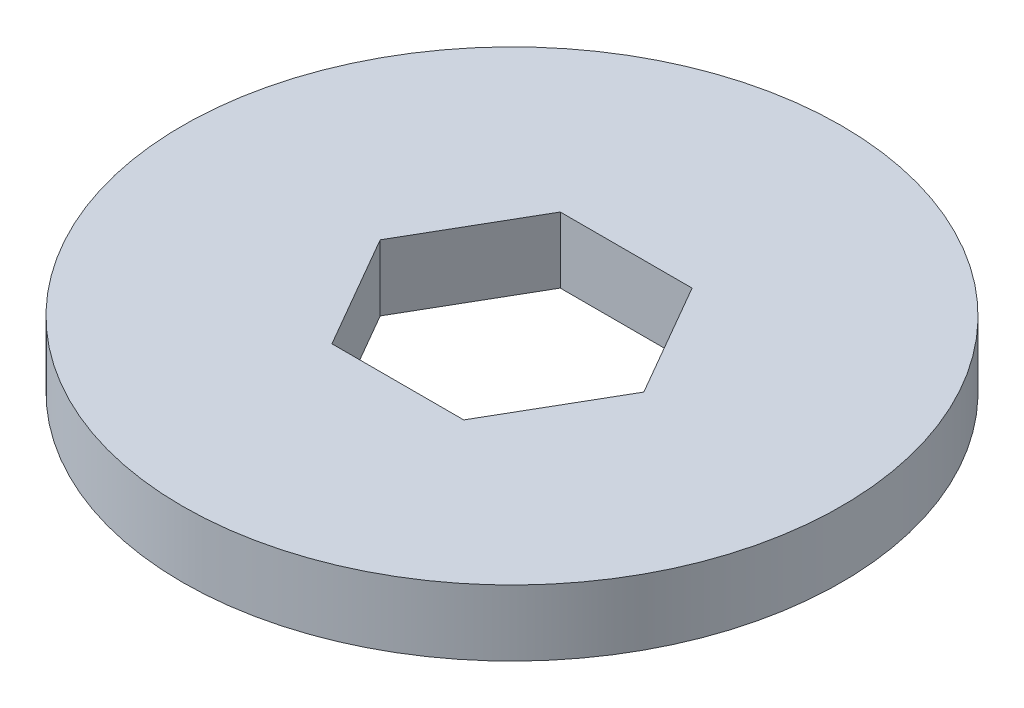
ISO-10303-21;
HEADER;
FILE_DESCRIPTION(('STEP AP214'),'2;1');
FILE_NAME('part.step','',(''),(''),'','','');
FILE_SCHEMA(('AUTOMOTIVE_DESIGN { 1 0 10303 214 1 1 1 1 }'));
ENDSEC;
DATA;
#1=APPLICATION_CONTEXT('core data for automotive mechanical design processes');
#2=APPLICATION_PROTOCOL_DEFINITION('international standard','automotive_design',2000,#1);
#3=PRODUCT_CONTEXT('',#1,'mechanical');
#4=PRODUCT('Part','Part','',(#3));
#5=PRODUCT_RELATED_PRODUCT_CATEGORY('part','',(#4));
#6=PRODUCT_DEFINITION_FORMATION('','',#4);
#7=PRODUCT_DEFINITION_CONTEXT('part definition',#1,'design');
#8=PRODUCT_DEFINITION('design','',#6,#7);
#9=PRODUCT_DEFINITION_SHAPE('','',#8);
#10=(LENGTH_UNIT() NAMED_UNIT(*) SI_UNIT(.MILLI.,.METRE.));
#11=(NAMED_UNIT(*) PLANE_ANGLE_UNIT() SI_UNIT($,.RADIAN.));
#12=(NAMED_UNIT(*) SI_UNIT($,.STERADIAN.) SOLID_ANGLE_UNIT());
#13=UNCERTAINTY_MEASURE_WITH_UNIT(LENGTH_MEASURE(1.E-05),#10,'distance_accuracy_value','');
#14=(GEOMETRIC_REPRESENTATION_CONTEXT(3) GLOBAL_UNCERTAINTY_ASSIGNED_CONTEXT((#13)) GLOBAL_UNIT_ASSIGNED_CONTEXT((#10,
#11,#12)) REPRESENTATION_CONTEXT('',''));
#15=CARTESIAN_POINT('',(0.,0.,0.));
#16=DIRECTION('',(0.,0.,1.));
#17=DIRECTION('',(1.,0.,0.));
#18=AXIS2_PLACEMENT_3D('',#15,#16,#17);
#19=CARTESIAN_POINT('',(0.,2.,0.));
#20=DIRECTION('',(0.,1.,0.));
#21=DIRECTION('',(0.,0.,1.));
#22=AXIS2_PLACEMENT_3D('',#19,#20,#21);
#23=PLANE('',#22);
#24=CARTESIAN_POINT('',(0.,2.,0.));
#25=DIRECTION('',(0.,1.,0.));
#26=DIRECTION('',(0.,0.,1.));
#27=AXIS2_PLACEMENT_3D('',#24,#25,#26);
#28=CIRCLE('',#27,10.);
#29=CARTESIAN_POINT('',(0.,2.,10.));
#30=VERTEX_POINT('',#29);
#31=EDGE_CURVE('E11',#30,#30,#28,.T.);
#32=ORIENTED_EDGE('',*,*,#31,.T.);
#33=EDGE_LOOP('',(#32));
#34=FACE_BOUND('',#33,.T.);
#35=DIRECTION('',(-0.500000000000001,0.,-0.866025403784438));
#36=VECTOR('',#35,1.);
#37=CARTESIAN_POINT('',(4.,2.,0.));
#38=LINE('',#37,#36);
#39=CARTESIAN_POINT('',(4.,2.,0.));
#40=VERTEX_POINT('',#39);
#41=CARTESIAN_POINT('',(1.99999999999999,2.,-3.46410161513776));
#42=VERTEX_POINT('',#41);
#43=EDGE_CURVE('E102',#40,#42,#38,.T.);
#44=ORIENTED_EDGE('',*,*,#43,.F.);
#45=DIRECTION('',(0.499999999999995,0.,-0.866025403784441));
#46=VECTOR('',#45,1.);
#47=CARTESIAN_POINT('',(2.00000000000004,2.,3.46410161513773));
#48=LINE('',#47,#46);
#49=CARTESIAN_POINT('',(2.00000000000004,2.,3.46410161513773));
#50=VERTEX_POINT('',#49);
#51=EDGE_CURVE('E93',#50,#40,#48,.T.);
#52=ORIENTED_EDGE('',*,*,#51,.F.);
#53=DIRECTION('',(1.,0.,0.));
#54=VECTOR('',#53,1.);
#55=CARTESIAN_POINT('',(-1.99999999999997,2.,3.46410161513777));
#56=LINE('',#55,#54);
#57=CARTESIAN_POINT('',(-1.99999999999997,2.,3.46410161513777));
#58=VERTEX_POINT('',#57);
#59=EDGE_CURVE('E127',#58,#50,#56,.T.);
#60=ORIENTED_EDGE('',*,*,#59,.F.);
#61=DIRECTION('',(0.500000000000007,0.,0.866025403784434));
#62=VECTOR('',#61,1.);
#63=CARTESIAN_POINT('',(-4.,2.,0.));
#64=LINE('',#63,#62);
#65=CARTESIAN_POINT('',(-4.,2.,0.));
#66=VERTEX_POINT('',#65);
#67=EDGE_CURVE('E124',#66,#58,#64,.T.);
#68=ORIENTED_EDGE('',*,*,#67,.F.);
#69=DIRECTION('',(-0.499999999999995,0.,0.866025403784441));
#70=VECTOR('',#69,1.);
#71=CARTESIAN_POINT('',(-2.00000000000002,2.,-3.46410161513774));
#72=LINE('',#71,#70);
#73=CARTESIAN_POINT('',(-2.00000000000002,2.,-3.46410161513774));
#74=VERTEX_POINT('',#73);
#75=EDGE_CURVE('E119',#74,#66,#72,.T.);
#76=ORIENTED_EDGE('',*,*,#75,.F.);
#77=DIRECTION('',(-1.,0.,0.));
#78=VECTOR('',#77,1.);
#79=CARTESIAN_POINT('',(1.99999999999999,2.,-3.46410161513776));
#80=LINE('',#79,#78);
#81=EDGE_CURVE('E115',#42,#74,#80,.T.);
#82=ORIENTED_EDGE('',*,*,#81,.F.);
#83=EDGE_LOOP('',(#44,#52,#60,#68,#76,#82));
#84=FACE_BOUND('',#83,.T.);
#85=ADVANCED_FACE('F39',(#34,#84),#23,.T.);
#86=CARTESIAN_POINT('',(0.,0.,0.));
#87=DIRECTION('',(0.,1.,0.));
#88=DIRECTION('',(0.,0.,1.));
#89=AXIS2_PLACEMENT_3D('',#86,#87,#88);
#90=PLANE('',#89);
#91=CARTESIAN_POINT('',(0.,0.,0.));
#92=DIRECTION('',(0.,1.,0.));
#93=DIRECTION('',(0.,0.,1.));
#94=AXIS2_PLACEMENT_3D('',#91,#92,#93);
#95=CIRCLE('',#94,10.);
#96=CARTESIAN_POINT('',(0.,0.,10.));
#97=VERTEX_POINT('',#96);
#98=EDGE_CURVE('E43',#97,#97,#95,.T.);
#99=ORIENTED_EDGE('',*,*,#98,.F.);
#100=EDGE_LOOP('',(#99));
#101=FACE_BOUND('',#100,.T.);
#102=DIRECTION('',(0.499999999999995,0.,-0.866025403784441));
#103=VECTOR('',#102,1.);
#104=CARTESIAN_POINT('',(2.00000000000004,0.,3.46410161513773));
#105=LINE('',#104,#103);
#106=CARTESIAN_POINT('',(2.00000000000004,0.,3.46410161513773));
#107=VERTEX_POINT('',#106);
#108=CARTESIAN_POINT('',(4.,0.,0.));
#109=VERTEX_POINT('',#108);
#110=EDGE_CURVE('E63',#107,#109,#105,.T.);
#111=ORIENTED_EDGE('',*,*,#110,.T.);
#112=DIRECTION('',(-0.500000000000001,0.,-0.866025403784438));
#113=VECTOR('',#112,1.);
#114=CARTESIAN_POINT('',(4.,0.,0.));
#115=LINE('',#114,#113);
#116=CARTESIAN_POINT('',(1.99999999999999,0.,-3.46410161513776));
#117=VERTEX_POINT('',#116);
#118=EDGE_CURVE('E109',#109,#117,#115,.T.);
#119=ORIENTED_EDGE('',*,*,#118,.T.);
#120=DIRECTION('',(-1.,0.,0.));
#121=VECTOR('',#120,1.);
#122=CARTESIAN_POINT('',(1.99999999999999,0.,-3.46410161513776));
#123=LINE('',#122,#121);
#124=CARTESIAN_POINT('',(-2.00000000000002,0.,-3.46410161513774));
#125=VERTEX_POINT('',#124);
#126=EDGE_CURVE('E134',#117,#125,#123,.T.);
#127=ORIENTED_EDGE('',*,*,#126,.T.);
#128=DIRECTION('',(-0.499999999999995,0.,0.866025403784441));
#129=VECTOR('',#128,1.);
#130=CARTESIAN_POINT('',(-2.00000000000002,0.,-3.46410161513774));
#131=LINE('',#130,#129);
#132=CARTESIAN_POINT('',(-4.,0.,0.));
#133=VERTEX_POINT('',#132);
#134=EDGE_CURVE('E138',#125,#133,#131,.T.);
#135=ORIENTED_EDGE('',*,*,#134,.T.);
#136=DIRECTION('',(0.500000000000007,0.,0.866025403784434));
#137=VECTOR('',#136,1.);
#138=CARTESIAN_POINT('',(-4.,0.,0.));
#139=LINE('',#138,#137);
#140=CARTESIAN_POINT('',(-1.99999999999997,0.,3.46410161513777));
#141=VERTEX_POINT('',#140);
#142=EDGE_CURVE('E142',#133,#141,#139,.T.);
#143=ORIENTED_EDGE('',*,*,#142,.T.);
#144=DIRECTION('',(1.,0.,0.));
#145=VECTOR('',#144,1.);
#146=CARTESIAN_POINT('',(-1.99999999999997,0.,3.46410161513777));
#147=LINE('',#146,#145);
#148=EDGE_CURVE('E103',#141,#107,#147,.T.);
#149=ORIENTED_EDGE('',*,*,#148,.T.);
#150=EDGE_LOOP('',(#111,#119,#127,#135,#143,#149));
#151=FACE_BOUND('',#150,.T.);
#152=ADVANCED_FACE('F166',(#101,#151),#90,.F.);
#153=CARTESIAN_POINT('',(0.,2.,0.));
#154=DIRECTION('',(0.,-1.,0.));
#155=DIRECTION('',(0.,0.,-1.));
#156=AXIS2_PLACEMENT_3D('',#153,#154,#155);
#157=CYLINDRICAL_SURFACE('',#156,10.);
#158=ORIENTED_EDGE('',*,*,#31,.F.);
#159=EDGE_LOOP('',(#158));
#160=FACE_BOUND('',#159,.T.);
#161=ORIENTED_EDGE('',*,*,#98,.T.);
#162=EDGE_LOOP('',(#161));
#163=FACE_BOUND('',#162,.T.);
#164=ADVANCED_FACE('F41',(#160,#163),#157,.T.);
#165=CARTESIAN_POINT('',(2.00000000000004,2.,3.46410161513773));
#166=DIRECTION('',(-0.866025403784441,0.,-0.499999999999995));
#167=DIRECTION('',(-0.499999999999995,0.,0.866025403784442));
#168=AXIS2_PLACEMENT_3D('',#165,#166,#167);
#169=PLANE('',#168);
#170=ORIENTED_EDGE('',*,*,#110,.F.);
#171=DIRECTION('',(0.,-1.,0.));
#172=VECTOR('',#171,1.);
#173=CARTESIAN_POINT('',(2.00000000000004,2.,3.46410161513773));
#174=LINE('',#173,#172);
#175=EDGE_CURVE('E97',#50,#107,#174,.T.);
#176=ORIENTED_EDGE('',*,*,#175,.F.);
#177=ORIENTED_EDGE('',*,*,#51,.T.);
#178=DIRECTION('',(0.,-1.,0.));
#179=VECTOR('',#178,1.);
#180=CARTESIAN_POINT('',(4.,2.,0.));
#181=LINE('',#180,#179);
#182=EDGE_CURVE('E96',#40,#109,#181,.T.);
#183=ORIENTED_EDGE('',*,*,#182,.T.);
#184=EDGE_LOOP('',(#170,#176,#177,#183));
#185=FACE_BOUND('',#184,.T.);
#186=ADVANCED_FACE('F95',(#185),#169,.T.);
#187=CARTESIAN_POINT('',(4.,2.,0.));
#188=DIRECTION('',(-0.866025403784438,0.,0.500000000000001));
#189=DIRECTION('',(0.500000000000001,0.,0.866025403784438));
#190=AXIS2_PLACEMENT_3D('',#187,#188,#189);
#191=PLANE('',#190);
#192=ORIENTED_EDGE('',*,*,#118,.F.);
#193=ORIENTED_EDGE('',*,*,#182,.F.);
#194=ORIENTED_EDGE('',*,*,#43,.T.);
#195=DIRECTION('',(0.,-1.,0.));
#196=VECTOR('',#195,1.);
#197=CARTESIAN_POINT('',(1.99999999999999,2.,-3.46410161513776));
#198=LINE('',#197,#196);
#199=EDGE_CURVE('E111',#42,#117,#198,.T.);
#200=ORIENTED_EDGE('',*,*,#199,.T.);
#201=EDGE_LOOP('',(#192,#193,#194,#200));
#202=FACE_BOUND('',#201,.T.);
#203=ADVANCED_FACE('F106',(#202),#191,.T.);
#204=CARTESIAN_POINT('',(1.99999999999999,2.,-3.46410161513776));
#205=DIRECTION('',(0.,0.,1.));
#206=DIRECTION('',(1.,0.,0.));
#207=AXIS2_PLACEMENT_3D('',#204,#205,#206);
#208=PLANE('',#207);
#209=ORIENTED_EDGE('',*,*,#126,.F.);
#210=ORIENTED_EDGE('',*,*,#199,.F.);
#211=ORIENTED_EDGE('',*,*,#81,.T.);
#212=DIRECTION('',(0.,-1.,0.));
#213=VECTOR('',#212,1.);
#214=CARTESIAN_POINT('',(-2.00000000000002,2.,-3.46410161513774));
#215=LINE('',#214,#213);
#216=EDGE_CURVE('E156',#74,#125,#215,.T.);
#217=ORIENTED_EDGE('',*,*,#216,.T.);
#218=EDGE_LOOP('',(#209,#210,#211,#217));
#219=FACE_BOUND('',#218,.T.);
#220=ADVANCED_FACE('F162',(#219),#208,.T.);
#221=CARTESIAN_POINT('',(-2.00000000000002,2.,-3.46410161513774));
#222=DIRECTION('',(0.866025403784441,0.,0.499999999999995));
#223=DIRECTION('',(0.499999999999995,0.,-0.866025403784442));
#224=AXIS2_PLACEMENT_3D('',#221,#222,#223);
#225=PLANE('',#224);
#226=ORIENTED_EDGE('',*,*,#134,.F.);
#227=ORIENTED_EDGE('',*,*,#216,.F.);
#228=ORIENTED_EDGE('',*,*,#75,.T.);
#229=DIRECTION('',(0.,-1.,0.));
#230=VECTOR('',#229,1.);
#231=CARTESIAN_POINT('',(-4.,2.,0.));
#232=LINE('',#231,#230);
#233=EDGE_CURVE('E153',#66,#133,#232,.T.);
#234=ORIENTED_EDGE('',*,*,#233,.T.);
#235=EDGE_LOOP('',(#226,#227,#228,#234));
#236=FACE_BOUND('',#235,.T.);
#237=ADVANCED_FACE('F174',(#236),#225,.T.);
#238=CARTESIAN_POINT('',(-4.,2.,0.));
#239=DIRECTION('',(0.866025403784434,0.,-0.500000000000007));
#240=DIRECTION('',(-0.500000000000007,0.,-0.866025403784434));
#241=AXIS2_PLACEMENT_3D('',#238,#239,#240);
#242=PLANE('',#241);
#243=ORIENTED_EDGE('',*,*,#142,.F.);
#244=ORIENTED_EDGE('',*,*,#233,.F.);
#245=ORIENTED_EDGE('',*,*,#67,.T.);
#246=DIRECTION('',(0.,-1.,0.));
#247=VECTOR('',#246,1.);
#248=CARTESIAN_POINT('',(-1.99999999999997,2.,3.46410161513777));
#249=LINE('',#248,#247);
#250=EDGE_CURVE('E55',#58,#141,#249,.T.);
#251=ORIENTED_EDGE('',*,*,#250,.T.);
#252=EDGE_LOOP('',(#243,#244,#245,#251));
#253=FACE_BOUND('',#252,.T.);
#254=ADVANCED_FACE('F172',(#253),#242,.T.);
#255=CARTESIAN_POINT('',(-1.99999999999997,2.,3.46410161513777));
#256=DIRECTION('',(0.,0.,-1.));
#257=DIRECTION('',(-1.,0.,0.));
#258=AXIS2_PLACEMENT_3D('',#255,#256,#257);
#259=PLANE('',#258);
#260=ORIENTED_EDGE('',*,*,#148,.F.);
#261=ORIENTED_EDGE('',*,*,#250,.F.);
#262=ORIENTED_EDGE('',*,*,#59,.T.);
#263=ORIENTED_EDGE('',*,*,#175,.T.);
#264=EDGE_LOOP('',(#260,#261,#262,#263));
#265=FACE_BOUND('',#264,.T.);
#266=ADVANCED_FACE('F168',(#265),#259,.T.);
#267=CLOSED_SHELL('',(#85,#152,#164,#186,#203,#220,#237,#254,#266));
#268=MANIFOLD_SOLID_BREP('B2',#267);
#269=ADVANCED_BREP_SHAPE_REPRESENTATION('',(#18,#268),#14);
#270=SHAPE_DEFINITION_REPRESENTATION(#9,#269);
ENDSEC;
END-ISO-10303-21;
